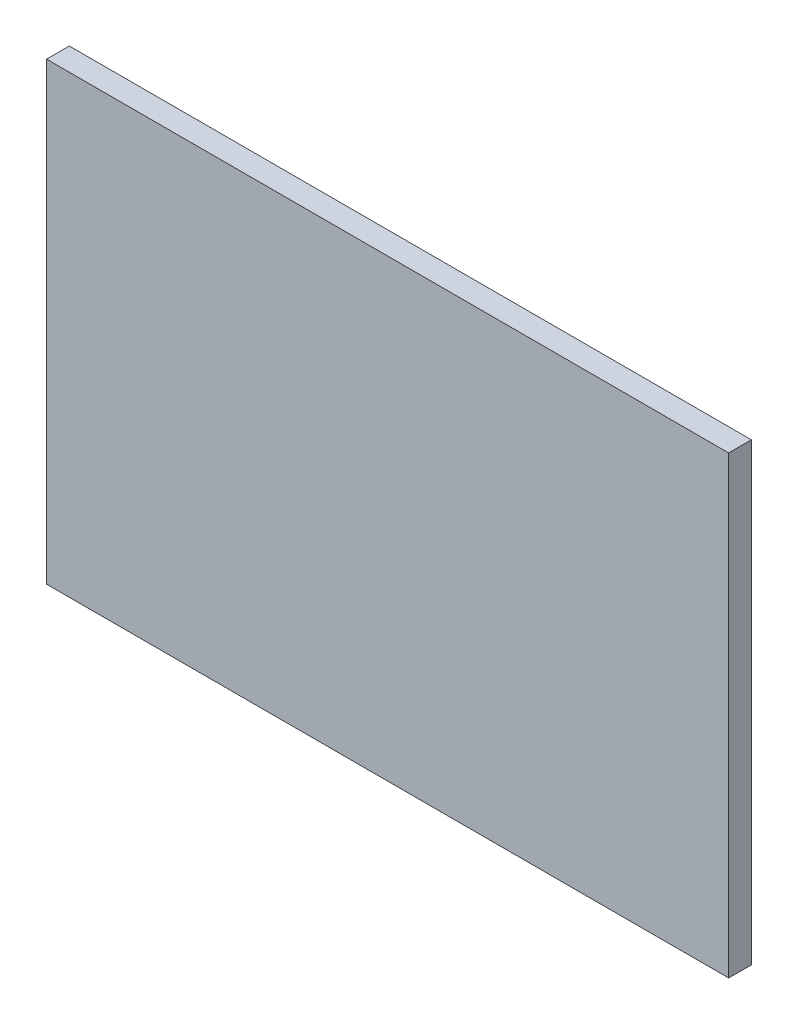
ISO-10303-21;
HEADER;
FILE_DESCRIPTION(('STEP AP214'),'2;1');
FILE_NAME('part.step','',(''),(''),'','','');
FILE_SCHEMA(('AUTOMOTIVE_DESIGN { 1 0 10303 214 1 1 1 1 }'));
ENDSEC;
DATA;
#1=APPLICATION_CONTEXT('core data for automotive mechanical design processes');
#2=APPLICATION_PROTOCOL_DEFINITION('international standard','automotive_design',2000,#1);
#3=PRODUCT_CONTEXT('',#1,'mechanical');
#4=PRODUCT('Part','Part','',(#3));
#5=PRODUCT_RELATED_PRODUCT_CATEGORY('part','',(#4));
#6=PRODUCT_DEFINITION_FORMATION('','',#4);
#7=PRODUCT_DEFINITION_CONTEXT('part definition',#1,'design');
#8=PRODUCT_DEFINITION('design','',#6,#7);
#9=PRODUCT_DEFINITION_SHAPE('','',#8);
#10=(LENGTH_UNIT() NAMED_UNIT(*) SI_UNIT(.MILLI.,.METRE.));
#11=(NAMED_UNIT(*) PLANE_ANGLE_UNIT() SI_UNIT($,.RADIAN.));
#12=(NAMED_UNIT(*) SI_UNIT($,.STERADIAN.) SOLID_ANGLE_UNIT());
#13=UNCERTAINTY_MEASURE_WITH_UNIT(LENGTH_MEASURE(1.E-05),#10,'distance_accuracy_value','');
#14=(GEOMETRIC_REPRESENTATION_CONTEXT(3) GLOBAL_UNCERTAINTY_ASSIGNED_CONTEXT((#13)) GLOBAL_UNIT_ASSIGNED_CONTEXT((#10,
#11,#12)) REPRESENTATION_CONTEXT('',''));
#15=CARTESIAN_POINT('',(0.,0.,0.));
#16=DIRECTION('',(0.,0.,1.));
#17=DIRECTION('',(1.,0.,0.));
#18=AXIS2_PLACEMENT_3D('',#15,#16,#17);
#19=CARTESIAN_POINT('',(39.729998779297,54.120998535156,1.1723000001));
#20=DIRECTION('',(0.,0.,1.));
#21=DIRECTION('',(1.,0.,0.));
#22=AXIS2_PLACEMENT_3D('',#19,#20,#21);
#23=PLANE('',#22);
#24=DIRECTION('',(-1.,0.,0.));
#25=VECTOR('',#24,1.);
#26=CARTESIAN_POINT('',(39.539499511719,54.247998046875,1.1723000001));
#27=LINE('',#26,#25);
#28=CARTESIAN_POINT('',(39.920498046875,54.247998046875,1.1723000001));
#29=VERTEX_POINT('',#28);
#30=CARTESIAN_POINT('',(39.539499511719,54.247998046875,1.1723000001));
#31=VERTEX_POINT('',#30);
#32=EDGE_CURVE('E28',#29,#31,#27,.T.);
#33=ORIENTED_EDGE('',*,*,#32,.T.);
#34=DIRECTION('',(0.,-1.,0.));
#35=VECTOR('',#34,1.);
#36=CARTESIAN_POINT('',(39.539499511719,53.993999023438,1.1723000001));
#37=LINE('',#36,#35);
#38=CARTESIAN_POINT('',(39.539499511719,53.993999023438,1.1723000001));
#39=VERTEX_POINT('',#38);
#40=EDGE_CURVE('E21',#31,#39,#37,.T.);
#41=ORIENTED_EDGE('',*,*,#40,.T.);
#42=DIRECTION('',(1.,0.,0.));
#43=VECTOR('',#42,1.);
#44=CARTESIAN_POINT('',(39.920498046875,53.993999023438,1.1723000001));
#45=LINE('',#44,#43);
#46=CARTESIAN_POINT('',(39.920498046875,53.993999023438,1.1723000001));
#47=VERTEX_POINT('',#46);
#48=EDGE_CURVE('E86',#39,#47,#45,.T.);
#49=ORIENTED_EDGE('',*,*,#48,.T.);
#50=DIRECTION('',(0.,1.,0.));
#51=VECTOR('',#50,1.);
#52=CARTESIAN_POINT('',(39.920498046875,54.247998046875,1.1723000001));
#53=LINE('',#52,#51);
#54=EDGE_CURVE('E11',#47,#29,#53,.T.);
#55=ORIENTED_EDGE('',*,*,#54,.T.);
#56=EDGE_LOOP('',(#33,#41,#49,#55));
#57=FACE_BOUND('',#56,.T.);
#58=ADVANCED_FACE('F17',(#57),#23,.T.);
#59=CARTESIAN_POINT('',(39.920498046875,54.247998046875,1.1596000001));
#60=DIRECTION('',(-1.,0.,0.));
#61=DIRECTION('',(0.,0.,1.));
#62=AXIS2_PLACEMENT_3D('',#59,#60,#61);
#63=PLANE('',#62);
#64=DIRECTION('',(0.,0.,-1.));
#65=VECTOR('',#64,1.);
#66=CARTESIAN_POINT('',(39.920498046875,53.993999023438,1.1596000001));
#67=LINE('',#66,#65);
#68=CARTESIAN_POINT('',(39.920498046875,53.993999023438,1.1596000001));
#69=VERTEX_POINT('',#68);
#70=EDGE_CURVE('E90',#47,#69,#67,.T.);
#71=ORIENTED_EDGE('',*,*,#70,.T.);
#72=DIRECTION('',(0.,1.,0.));
#73=VECTOR('',#72,1.);
#74=CARTESIAN_POINT('',(39.920498046875,54.120998535156,1.1596000001));
#75=LINE('',#74,#73);
#76=CARTESIAN_POINT('',(39.920498046875,54.247998046875,1.1596000001));
#77=VERTEX_POINT('',#76);
#78=EDGE_CURVE('E105',#69,#77,#75,.T.);
#79=ORIENTED_EDGE('',*,*,#78,.T.);
#80=DIRECTION('',(0.,0.,1.));
#81=VECTOR('',#80,1.);
#82=CARTESIAN_POINT('',(39.920498046875,54.247998046875,1.1596000001));
#83=LINE('',#82,#81);
#84=EDGE_CURVE('E78',#77,#29,#83,.T.);
#85=ORIENTED_EDGE('',*,*,#84,.T.);
#86=ORIENTED_EDGE('',*,*,#54,.F.);
#87=EDGE_LOOP('',(#71,#79,#85,#86));
#88=FACE_BOUND('',#87,.T.);
#89=ADVANCED_FACE('F127',(#88),#63,.F.);
#90=CARTESIAN_POINT('',(39.539499511719,54.247998046875,1.1596000001));
#91=DIRECTION('',(0.,-1.,0.));
#92=DIRECTION('',(0.,0.,-1.));
#93=AXIS2_PLACEMENT_3D('',#90,#91,#92);
#94=PLANE('',#93);
#95=ORIENTED_EDGE('',*,*,#84,.F.);
#96=DIRECTION('',(-1.,0.,0.));
#97=VECTOR('',#96,1.);
#98=CARTESIAN_POINT('',(39.729998779297,54.247998046875,1.1596000001));
#99=LINE('',#98,#97);
#100=CARTESIAN_POINT('',(39.539499511719,54.247998046875,1.1596000001));
#101=VERTEX_POINT('',#100);
#102=EDGE_CURVE('E114',#77,#101,#99,.T.);
#103=ORIENTED_EDGE('',*,*,#102,.T.);
#104=DIRECTION('',(0.,0.,1.));
#105=VECTOR('',#104,1.);
#106=CARTESIAN_POINT('',(39.539499511719,54.247998046875,1.1596000001));
#107=LINE('',#106,#105);
#108=EDGE_CURVE('E60',#101,#31,#107,.T.);
#109=ORIENTED_EDGE('',*,*,#108,.T.);
#110=ORIENTED_EDGE('',*,*,#32,.F.);
#111=EDGE_LOOP('',(#95,#103,#109,#110));
#112=FACE_BOUND('',#111,.T.);
#113=ADVANCED_FACE('F19',(#112),#94,.F.);
#114=CARTESIAN_POINT('',(39.539499511719,53.993999023438,1.1596000001));
#115=DIRECTION('',(1.,0.,0.));
#116=DIRECTION('',(0.,1.,0.));
#117=AXIS2_PLACEMENT_3D('',#114,#115,#116);
#118=PLANE('',#117);
#119=ORIENTED_EDGE('',*,*,#108,.F.);
#120=DIRECTION('',(0.,-1.,0.));
#121=VECTOR('',#120,1.);
#122=CARTESIAN_POINT('',(39.539499511719,54.120998535156,1.1596000001));
#123=LINE('',#122,#121);
#124=CARTESIAN_POINT('',(39.539499511719,53.993999023438,1.1596000001));
#125=VERTEX_POINT('',#124);
#126=EDGE_CURVE('E95',#101,#125,#123,.T.);
#127=ORIENTED_EDGE('',*,*,#126,.T.);
#128=DIRECTION('',(0.,0.,1.));
#129=VECTOR('',#128,1.);
#130=CARTESIAN_POINT('',(39.539499511719,53.993999023438,1.1596000001));
#131=LINE('',#130,#129);
#132=EDGE_CURVE('E68',#125,#39,#131,.T.);
#133=ORIENTED_EDGE('',*,*,#132,.T.);
#134=ORIENTED_EDGE('',*,*,#40,.F.);
#135=EDGE_LOOP('',(#119,#127,#133,#134));
#136=FACE_BOUND('',#135,.T.);
#137=ADVANCED_FACE('F93',(#136),#118,.F.);
#138=CARTESIAN_POINT('',(39.920498046875,53.993999023438,1.1596000001));
#139=DIRECTION('',(0.,1.,0.));
#140=DIRECTION('',(1.,0.,0.));
#141=AXIS2_PLACEMENT_3D('',#138,#139,#140);
#142=PLANE('',#141);
#143=ORIENTED_EDGE('',*,*,#132,.F.);
#144=DIRECTION('',(1.,0.,0.));
#145=VECTOR('',#144,1.);
#146=CARTESIAN_POINT('',(39.729998779297,53.993999023438,1.1596000001));
#147=LINE('',#146,#145);
#148=EDGE_CURVE('E97',#125,#69,#147,.T.);
#149=ORIENTED_EDGE('',*,*,#148,.T.);
#150=ORIENTED_EDGE('',*,*,#70,.F.);
#151=ORIENTED_EDGE('',*,*,#48,.F.);
#152=EDGE_LOOP('',(#143,#149,#150,#151));
#153=FACE_BOUND('',#152,.T.);
#154=ADVANCED_FACE('F89',(#153),#142,.F.);
#155=CARTESIAN_POINT('',(39.729998779297,54.120998535156,1.1596000001));
#156=DIRECTION('',(0.,0.,1.));
#157=DIRECTION('',(1.,0.,0.));
#158=AXIS2_PLACEMENT_3D('',#155,#156,#157);
#159=PLANE('',#158);
#160=ORIENTED_EDGE('',*,*,#126,.F.);
#161=ORIENTED_EDGE('',*,*,#102,.F.);
#162=ORIENTED_EDGE('',*,*,#78,.F.);
#163=ORIENTED_EDGE('',*,*,#148,.F.);
#164=EDGE_LOOP('',(#160,#161,#162,#163));
#165=FACE_BOUND('',#164,.T.);
#166=ADVANCED_FACE('F139',(#165),#159,.F.);
#167=CLOSED_SHELL('',(#58,#89,#113,#137,#154,#166));
#168=MANIFOLD_SOLID_BREP('B1',#167);
#169=ADVANCED_BREP_SHAPE_REPRESENTATION('',(#18,#168),#14);
#170=SHAPE_DEFINITION_REPRESENTATION(#9,#169);
ENDSEC;
END-ISO-10303-21;
